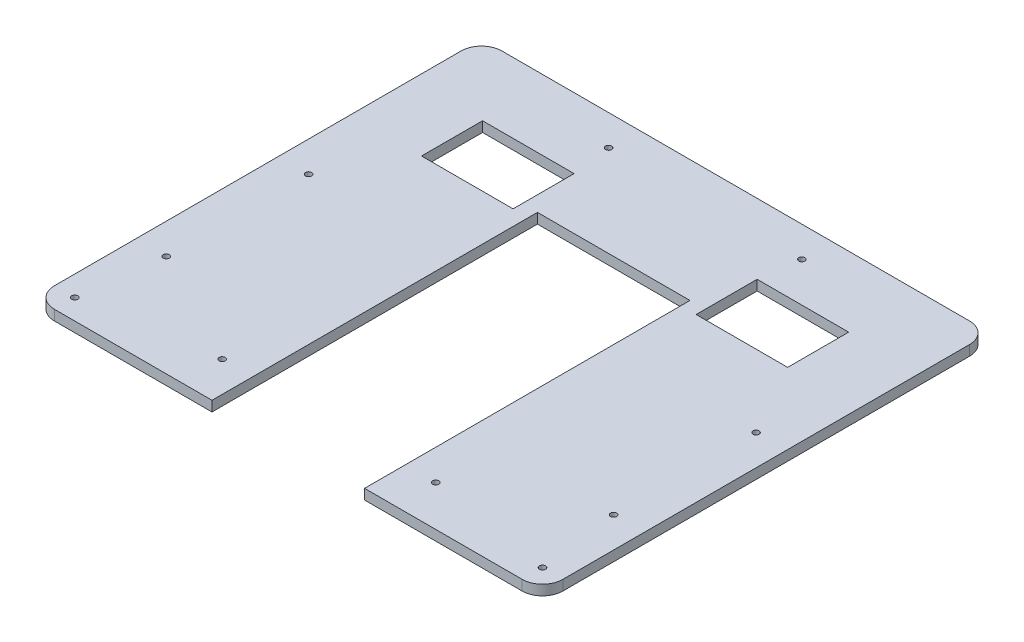
ISO-10303-21;
HEADER;
FILE_DESCRIPTION(('STEP AP214'),'2;1');
FILE_NAME('part.step','',(''),(''),'','','');
FILE_SCHEMA(('AUTOMOTIVE_DESIGN { 1 0 10303 214 1 1 1 1 }'));
ENDSEC;
DATA;
#1=APPLICATION_CONTEXT('core data for automotive mechanical design processes');
#2=APPLICATION_PROTOCOL_DEFINITION('international standard','automotive_design',2000,#1);
#3=PRODUCT_CONTEXT('',#1,'mechanical');
#4=PRODUCT('Part','Part','',(#3));
#5=PRODUCT_RELATED_PRODUCT_CATEGORY('part','',(#4));
#6=PRODUCT_DEFINITION_FORMATION('','',#4);
#7=PRODUCT_DEFINITION_CONTEXT('part definition',#1,'design');
#8=PRODUCT_DEFINITION('design','',#6,#7);
#9=PRODUCT_DEFINITION_SHAPE('','',#8);
#10=(LENGTH_UNIT() NAMED_UNIT(*) SI_UNIT(.MILLI.,.METRE.));
#11=(NAMED_UNIT(*) PLANE_ANGLE_UNIT() SI_UNIT($,.RADIAN.));
#12=(NAMED_UNIT(*) SI_UNIT($,.STERADIAN.) SOLID_ANGLE_UNIT());
#13=UNCERTAINTY_MEASURE_WITH_UNIT(LENGTH_MEASURE(1.E-05),#10,'distance_accuracy_value','');
#14=(GEOMETRIC_REPRESENTATION_CONTEXT(3) GLOBAL_UNCERTAINTY_ASSIGNED_CONTEXT((#13)) GLOBAL_UNIT_ASSIGNED_CONTEXT((#10,
#11,#12)) REPRESENTATION_CONTEXT('',''));
#15=CARTESIAN_POINT('',(0.,0.,0.));
#16=DIRECTION('',(0.,0.,1.));
#17=DIRECTION('',(1.,0.,0.));
#18=AXIS2_PLACEMENT_3D('',#15,#16,#17);
#19=CARTESIAN_POINT('',(10.,5.,210.));
#20=DIRECTION('',(0.,1.,0.));
#21=DIRECTION('',(0.,0.,1.));
#22=AXIS2_PLACEMENT_3D('',#19,#20,#21);
#23=PLANE('',#22);
#24=CARTESIAN_POINT('',(172.5,5.,15.));
#25=DIRECTION('',(0.,1.,0.));
#26=DIRECTION('',(0.,0.,1.));
#27=AXIS2_PLACEMENT_3D('',#24,#25,#26);
#28=CIRCLE('',#27,1.49999999999997);
#29=CARTESIAN_POINT('',(172.5,5.,16.5));
#30=VERTEX_POINT('',#29);
#31=EDGE_CURVE('E725',#30,#30,#28,.F.);
#32=ORIENTED_EDGE('',*,*,#31,.T.);
#33=EDGE_LOOP('',(#32));
#34=FACE_BOUND('',#33,.T.);
#35=CARTESIAN_POINT('',(240.,5.,210.));
#36=DIRECTION('',(0.,1.,0.));
#37=DIRECTION('',(0.,0.,1.));
#38=AXIS2_PLACEMENT_3D('',#35,#36,#37);
#39=CIRCLE('',#38,1.50000000000002);
#40=CARTESIAN_POINT('',(240.,5.,211.5));
#41=VERTEX_POINT('',#40);
#42=EDGE_CURVE('E802',#41,#41,#39,.F.);
#43=ORIENTED_EDGE('',*,*,#42,.T.);
#44=EDGE_LOOP('',(#43));
#45=FACE_BOUND('',#44,.T.);
#46=CARTESIAN_POINT('',(10.,5.,210.));
#47=DIRECTION('',(0.,1.,0.));
#48=DIRECTION('',(0.,0.,1.));
#49=AXIS2_PLACEMENT_3D('',#46,#47,#48);
#50=CIRCLE('',#49,1.5);
#51=CARTESIAN_POINT('',(10.,5.,211.5));
#52=VERTEX_POINT('',#51);
#53=EDGE_CURVE('E741',#52,#52,#50,.F.);
#54=ORIENTED_EDGE('',*,*,#53,.T.);
#55=EDGE_LOOP('',(#54));
#56=FACE_BOUND('',#55,.T.);
#57=CARTESIAN_POINT('',(77.5,5.,15.));
#58=DIRECTION('',(0.,1.,0.));
#59=DIRECTION('',(0.,0.,1.));
#60=AXIS2_PLACEMENT_3D('',#57,#58,#59);
#61=CIRCLE('',#60,1.5);
#62=CARTESIAN_POINT('',(77.5,5.,16.5));
#63=VERTEX_POINT('',#62);
#64=EDGE_CURVE('E738',#63,#63,#61,.F.);
#65=ORIENTED_EDGE('',*,*,#64,.T.);
#66=EDGE_LOOP('',(#65));
#67=FACE_BOUND('',#66,.T.);
#68=CARTESIAN_POINT('',(15.,5.,170.));
#69=DIRECTION('',(0.,1.,0.));
#70=DIRECTION('',(0.,0.,1.));
#71=AXIS2_PLACEMENT_3D('',#68,#69,#70);
#72=CIRCLE('',#71,1.5);
#73=CARTESIAN_POINT('',(15.,5.,171.5));
#74=VERTEX_POINT('',#73);
#75=EDGE_CURVE('E754',#74,#74,#72,.F.);
#76=ORIENTED_EDGE('',*,*,#75,.T.);
#77=EDGE_LOOP('',(#76));
#78=FACE_BOUND('',#77,.T.);
#79=CARTESIAN_POINT('',(15.,5.,100.));
#80=DIRECTION('',(0.,1.,0.));
#81=DIRECTION('',(0.,0.,1.));
#82=AXIS2_PLACEMENT_3D('',#79,#80,#81);
#83=CIRCLE('',#82,1.5);
#84=CARTESIAN_POINT('',(15.,5.,101.5));
#85=VERTEX_POINT('',#84);
#86=EDGE_CURVE('E748',#85,#85,#83,.F.);
#87=ORIENTED_EDGE('',*,*,#86,.T.);
#88=EDGE_LOOP('',(#87));
#89=FACE_BOUND('',#88,.T.);
#90=CARTESIAN_POINT('',(235.,5.,100.));
#91=DIRECTION('',(0.,1.,0.));
#92=DIRECTION('',(0.,0.,1.));
#93=AXIS2_PLACEMENT_3D('',#90,#91,#92);
#94=CIRCLE('',#93,1.5);
#95=CARTESIAN_POINT('',(235.,5.,101.5));
#96=VERTEX_POINT('',#95);
#97=EDGE_CURVE('E742',#96,#96,#94,.F.);
#98=ORIENTED_EDGE('',*,*,#97,.T.);
#99=EDGE_LOOP('',(#98));
#100=FACE_BOUND('',#99,.T.);
#101=CARTESIAN_POINT('',(235.,5.,170.));
#102=DIRECTION('',(0.,1.,0.));
#103=DIRECTION('',(0.,0.,1.));
#104=AXIS2_PLACEMENT_3D('',#101,#102,#103);
#105=CIRCLE('',#104,1.5);
#106=CARTESIAN_POINT('',(235.,5.,171.5));
#107=VERTEX_POINT('',#106);
#108=EDGE_CURVE('E393',#107,#107,#105,.F.);
#109=ORIENTED_EDGE('',*,*,#108,.T.);
#110=EDGE_LOOP('',(#109));
#111=FACE_BOUND('',#110,.T.);
#112=CARTESIAN_POINT('',(177.5,5.,200.));
#113=DIRECTION('',(0.,1.,0.));
#114=DIRECTION('',(0.,0.,1.));
#115=AXIS2_PLACEMENT_3D('',#112,#113,#114);
#116=CIRCLE('',#115,1.50000000000002);
#117=CARTESIAN_POINT('',(177.5,5.,201.5));
#118=VERTEX_POINT('',#117);
#119=EDGE_CURVE('E396',#118,#118,#116,.T.);
#120=ORIENTED_EDGE('',*,*,#119,.F.);
#121=EDGE_LOOP('',(#120));
#122=FACE_BOUND('',#121,.T.);
#123=DIRECTION('',(0.,0.,1.));
#124=VECTOR('',#123,1.);
#125=CARTESIAN_POINT('',(162.5,5.,220.));
#126=LINE('',#125,#124);
#127=CARTESIAN_POINT('',(162.5,5.,60.));
#128=VERTEX_POINT('',#127);
#129=CARTESIAN_POINT('',(162.5,5.,220.));
#130=VERTEX_POINT('',#129);
#131=EDGE_CURVE('E176',#128,#130,#126,.T.);
#132=ORIENTED_EDGE('',*,*,#131,.T.);
#133=DIRECTION('',(1.,0.,0.));
#134=VECTOR('',#133,1.);
#135=CARTESIAN_POINT('',(10.0000000000001,5.,220.));
#136=LINE('',#135,#134);
#137=CARTESIAN_POINT('',(240.,5.,220.));
#138=VERTEX_POINT('',#137);
#139=EDGE_CURVE('E188',#130,#138,#136,.T.);
#140=ORIENTED_EDGE('',*,*,#139,.T.);
#141=CARTESIAN_POINT('',(240.,5.,210.));
#142=DIRECTION('',(0.,1.,0.));
#143=DIRECTION('',(0.,0.,1.));
#144=AXIS2_PLACEMENT_3D('',#141,#142,#143);
#145=CIRCLE('',#144,10.);
#146=CARTESIAN_POINT('',(250.,5.,210.));
#147=VERTEX_POINT('',#146);
#148=EDGE_CURVE('E200',#138,#147,#145,.T.);
#149=ORIENTED_EDGE('',*,*,#148,.T.);
#150=DIRECTION('',(0.,0.,-1.));
#151=VECTOR('',#150,1.);
#152=CARTESIAN_POINT('',(250.,5.,10.0000000000001));
#153=LINE('',#152,#151);
#154=CARTESIAN_POINT('',(250.,5.,10.0000000000001));
#155=VERTEX_POINT('',#154);
#156=EDGE_CURVE('E207',#147,#155,#153,.T.);
#157=ORIENTED_EDGE('',*,*,#156,.T.);
#158=CARTESIAN_POINT('',(240.,5.,10.));
#159=DIRECTION('',(0.,1.,0.));
#160=DIRECTION('',(0.,0.,-1.));
#161=AXIS2_PLACEMENT_3D('',#158,#159,#160);
#162=CIRCLE('',#161,10.);
#163=CARTESIAN_POINT('',(240.,5.,0.));
#164=VERTEX_POINT('',#163);
#165=EDGE_CURVE('E209',#155,#164,#162,.T.);
#166=ORIENTED_EDGE('',*,*,#165,.T.);
#167=DIRECTION('',(-1.,0.,0.));
#168=VECTOR('',#167,1.);
#169=CARTESIAN_POINT('',(10.0000000000001,5.,0.));
#170=LINE('',#169,#168);
#171=CARTESIAN_POINT('',(10.0000000000001,5.,0.));
#172=VERTEX_POINT('',#171);
#173=EDGE_CURVE('E211',#164,#172,#170,.T.);
#174=ORIENTED_EDGE('',*,*,#173,.T.);
#175=CARTESIAN_POINT('',(10.,5.,10.));
#176=DIRECTION('',(0.,1.,0.));
#177=DIRECTION('',(0.,0.,1.));
#178=AXIS2_PLACEMENT_3D('',#175,#176,#177);
#179=CIRCLE('',#178,10.);
#180=CARTESIAN_POINT('',(0.,5.,10.0000000000001));
#181=VERTEX_POINT('',#180);
#182=EDGE_CURVE('E213',#172,#181,#179,.T.);
#183=ORIENTED_EDGE('',*,*,#182,.T.);
#184=DIRECTION('',(0.,0.,1.));
#185=VECTOR('',#184,1.);
#186=CARTESIAN_POINT('',(0.,5.,10.0000000000001));
#187=LINE('',#186,#185);
#188=CARTESIAN_POINT('',(0.,5.,210.));
#189=VERTEX_POINT('',#188);
#190=EDGE_CURVE('E215',#181,#189,#187,.T.);
#191=ORIENTED_EDGE('',*,*,#190,.T.);
#192=CARTESIAN_POINT('',(10.,5.,210.));
#193=DIRECTION('',(0.,1.,0.));
#194=DIRECTION('',(0.,0.,1.));
#195=AXIS2_PLACEMENT_3D('',#192,#193,#194);
#196=CIRCLE('',#195,10.);
#197=CARTESIAN_POINT('',(10.0000000000001,5.,220.));
#198=VERTEX_POINT('',#197);
#199=EDGE_CURVE('E197',#189,#198,#196,.T.);
#200=ORIENTED_EDGE('',*,*,#199,.T.);
#201=CARTESIAN_POINT('',(87.4999999999999,5.,220.));
#202=VERTEX_POINT('',#201);
#203=EDGE_CURVE('E196',#198,#202,#136,.T.);
#204=ORIENTED_EDGE('',*,*,#203,.T.);
#205=DIRECTION('',(0.,0.,-1.));
#206=VECTOR('',#205,1.);
#207=CARTESIAN_POINT('',(87.5,5.,220.));
#208=LINE('',#207,#206);
#209=CARTESIAN_POINT('',(87.5,5.,60.));
#210=VERTEX_POINT('',#209);
#211=EDGE_CURVE('E51',#202,#210,#208,.T.);
#212=ORIENTED_EDGE('',*,*,#211,.T.);
#213=DIRECTION('',(1.,0.,0.));
#214=VECTOR('',#213,1.);
#215=CARTESIAN_POINT('',(162.5,5.,60.));
#216=LINE('',#215,#214);
#217=EDGE_CURVE('E184',#210,#128,#216,.T.);
#218=ORIENTED_EDGE('',*,*,#217,.T.);
#219=EDGE_LOOP('',(#132,#140,#149,#157,#166,#174,#183,#191,#200,#204,#212,#218));
#220=FACE_BOUND('',#219,.T.);
#221=DIRECTION('',(-1.,0.,0.));
#222=VECTOR('',#221,1.);
#223=CARTESIAN_POINT('',(215.,5.,34.475));
#224=LINE('',#223,#222);
#225=CARTESIAN_POINT('',(215.,5.,34.475));
#226=VERTEX_POINT('',#225);
#227=CARTESIAN_POINT('',(170.,5.,34.475));
#228=VERTEX_POINT('',#227);
#229=EDGE_CURVE('E356',#226,#228,#224,.T.);
#230=ORIENTED_EDGE('',*,*,#229,.F.);
#231=DIRECTION('',(0.,0.,-1.));
#232=VECTOR('',#231,1.);
#233=CARTESIAN_POINT('',(215.,5.,64.475));
#234=LINE('',#233,#232);
#235=CARTESIAN_POINT('',(215.,5.,64.475));
#236=VERTEX_POINT('',#235);
#237=EDGE_CURVE('E343',#236,#226,#234,.T.);
#238=ORIENTED_EDGE('',*,*,#237,.F.);
#239=DIRECTION('',(-1.,0.,0.));
#240=VECTOR('',#239,1.);
#241=CARTESIAN_POINT('',(215.,5.,64.475));
#242=LINE('',#241,#240);
#243=CARTESIAN_POINT('',(170.,5.,64.475));
#244=VERTEX_POINT('',#243);
#245=EDGE_CURVE('E338',#236,#244,#242,.T.);
#246=ORIENTED_EDGE('',*,*,#245,.T.);
#247=DIRECTION('',(0.,0.,-1.));
#248=VECTOR('',#247,1.);
#249=CARTESIAN_POINT('',(170.,5.,64.475));
#250=LINE('',#249,#248);
#251=EDGE_CURVE('E353',#244,#228,#250,.T.);
#252=ORIENTED_EDGE('',*,*,#251,.T.);
#253=EDGE_LOOP('',(#230,#238,#246,#252));
#254=FACE_BOUND('',#253,.T.);
#255=DIRECTION('',(1.,0.,0.));
#256=VECTOR('',#255,1.);
#257=CARTESIAN_POINT('',(0.,5.,34.475));
#258=LINE('',#257,#256);
#259=CARTESIAN_POINT('',(35.,5.,34.475));
#260=VERTEX_POINT('',#259);
#261=CARTESIAN_POINT('',(80.,5.,34.475));
#262=VERTEX_POINT('',#261);
#263=EDGE_CURVE('E305',#260,#262,#258,.T.);
#264=ORIENTED_EDGE('',*,*,#263,.T.);
#265=DIRECTION('',(0.,0.,-1.));
#266=VECTOR('',#265,1.);
#267=CARTESIAN_POINT('',(80.,5.,0.));
#268=LINE('',#267,#266);
#269=CARTESIAN_POINT('',(80.,5.,64.475));
#270=VERTEX_POINT('',#269);
#271=EDGE_CURVE('E299',#270,#262,#268,.T.);
#272=ORIENTED_EDGE('',*,*,#271,.F.);
#273=DIRECTION('',(1.,0.,0.));
#274=VECTOR('',#273,1.);
#275=CARTESIAN_POINT('',(0.,5.,64.475));
#276=LINE('',#275,#274);
#277=CARTESIAN_POINT('',(35.,5.,64.475));
#278=VERTEX_POINT('',#277);
#279=EDGE_CURVE('E301',#278,#270,#276,.T.);
#280=ORIENTED_EDGE('',*,*,#279,.F.);
#281=DIRECTION('',(0.,0.,-1.));
#282=VECTOR('',#281,1.);
#283=CARTESIAN_POINT('',(35.,5.,0.));
#284=LINE('',#283,#282);
#285=EDGE_CURVE('E59',#278,#260,#284,.T.);
#286=ORIENTED_EDGE('',*,*,#285,.T.);
#287=EDGE_LOOP('',(#264,#272,#280,#286));
#288=FACE_BOUND('',#287,.T.);
#289=CARTESIAN_POINT('',(72.5,5.,200.));
#290=DIRECTION('',(0.,1.,0.));
#291=DIRECTION('',(0.,0.,1.));
#292=AXIS2_PLACEMENT_3D('',#289,#290,#291);
#293=CIRCLE('',#292,1.50000000000001);
#294=CARTESIAN_POINT('',(72.5,5.,201.5));
#295=VERTEX_POINT('',#294);
#296=EDGE_CURVE('E386',#295,#295,#293,.F.);
#297=ORIENTED_EDGE('',*,*,#296,.T.);
#298=EDGE_LOOP('',(#297));
#299=FACE_BOUND('',#298,.T.);
#300=ADVANCED_FACE('F36',(#34,#45,#56,#67,#78,#89,#100,#111,#122,#220,#254,#288,#299),#23,.T.);
#301=CARTESIAN_POINT('',(10.,0.,210.));
#302=DIRECTION('',(0.,1.,0.));
#303=DIRECTION('',(0.,0.,1.));
#304=AXIS2_PLACEMENT_3D('',#301,#302,#303);
#305=PLANE('',#304);
#306=CARTESIAN_POINT('',(172.5,0.,15.));
#307=DIRECTION('',(0.,-1.,0.));
#308=DIRECTION('',(0.,0.,1.));
#309=AXIS2_PLACEMENT_3D('',#306,#307,#308);
#310=CIRCLE('',#309,1.49999999999997);
#311=CARTESIAN_POINT('',(172.5,0.,16.5));
#312=VERTEX_POINT('',#311);
#313=EDGE_CURVE('E728',#312,#312,#310,.T.);
#314=ORIENTED_EDGE('',*,*,#313,.F.);
#315=EDGE_LOOP('',(#314));
#316=FACE_BOUND('',#315,.T.);
#317=CARTESIAN_POINT('',(240.,0.,210.));
#318=DIRECTION('',(0.,-1.,0.));
#319=DIRECTION('',(0.,0.,1.));
#320=AXIS2_PLACEMENT_3D('',#317,#318,#319);
#321=CIRCLE('',#320,1.50000000000002);
#322=CARTESIAN_POINT('',(240.,0.,211.5));
#323=VERTEX_POINT('',#322);
#324=EDGE_CURVE('E730',#323,#323,#321,.T.);
#325=ORIENTED_EDGE('',*,*,#324,.F.);
#326=EDGE_LOOP('',(#325));
#327=FACE_BOUND('',#326,.T.);
#328=CARTESIAN_POINT('',(10.,0.,210.));
#329=DIRECTION('',(0.,-1.,0.));
#330=DIRECTION('',(0.,0.,-1.));
#331=AXIS2_PLACEMENT_3D('',#328,#329,#330);
#332=CIRCLE('',#331,1.5);
#333=CARTESIAN_POINT('',(10.,0.,208.5));
#334=VERTEX_POINT('',#333);
#335=EDGE_CURVE('E797',#334,#334,#332,.T.);
#336=ORIENTED_EDGE('',*,*,#335,.F.);
#337=EDGE_LOOP('',(#336));
#338=FACE_BOUND('',#337,.T.);
#339=CARTESIAN_POINT('',(77.5,0.,15.));
#340=DIRECTION('',(0.,-1.,0.));
#341=DIRECTION('',(0.,0.,-1.));
#342=AXIS2_PLACEMENT_3D('',#339,#340,#341);
#343=CIRCLE('',#342,1.5);
#344=CARTESIAN_POINT('',(77.5,0.,13.5));
#345=VERTEX_POINT('',#344);
#346=EDGE_CURVE('E734',#345,#345,#343,.T.);
#347=ORIENTED_EDGE('',*,*,#346,.F.);
#348=EDGE_LOOP('',(#347));
#349=FACE_BOUND('',#348,.T.);
#350=CARTESIAN_POINT('',(15.,0.,170.));
#351=DIRECTION('',(0.,-1.,0.));
#352=DIRECTION('',(0.,0.,1.));
#353=AXIS2_PLACEMENT_3D('',#350,#351,#352);
#354=CIRCLE('',#353,1.5);
#355=CARTESIAN_POINT('',(15.,0.,171.5));
#356=VERTEX_POINT('',#355);
#357=EDGE_CURVE('E737',#356,#356,#354,.T.);
#358=ORIENTED_EDGE('',*,*,#357,.F.);
#359=EDGE_LOOP('',(#358));
#360=FACE_BOUND('',#359,.T.);
#361=CARTESIAN_POINT('',(15.,0.,100.));
#362=DIRECTION('',(0.,-1.,0.));
#363=DIRECTION('',(0.,0.,1.));
#364=AXIS2_PLACEMENT_3D('',#361,#362,#363);
#365=CIRCLE('',#364,1.5);
#366=CARTESIAN_POINT('',(15.,0.,101.5));
#367=VERTEX_POINT('',#366);
#368=EDGE_CURVE('E751',#367,#367,#365,.T.);
#369=ORIENTED_EDGE('',*,*,#368,.F.);
#370=EDGE_LOOP('',(#369));
#371=FACE_BOUND('',#370,.T.);
#372=CARTESIAN_POINT('',(235.,0.,100.));
#373=DIRECTION('',(0.,-1.,0.));
#374=DIRECTION('',(0.,0.,-1.));
#375=AXIS2_PLACEMENT_3D('',#372,#373,#374);
#376=CIRCLE('',#375,1.5);
#377=CARTESIAN_POINT('',(235.,0.,98.5));
#378=VERTEX_POINT('',#377);
#379=EDGE_CURVE('E745',#378,#378,#376,.T.);
#380=ORIENTED_EDGE('',*,*,#379,.F.);
#381=EDGE_LOOP('',(#380));
#382=FACE_BOUND('',#381,.T.);
#383=CARTESIAN_POINT('',(235.,0.,170.));
#384=DIRECTION('',(0.,-1.,0.));
#385=DIRECTION('',(0.,0.,-1.));
#386=AXIS2_PLACEMENT_3D('',#383,#384,#385);
#387=CIRCLE('',#386,1.5);
#388=CARTESIAN_POINT('',(235.,0.,168.5));
#389=VERTEX_POINT('',#388);
#390=EDGE_CURVE('E399',#389,#389,#387,.T.);
#391=ORIENTED_EDGE('',*,*,#390,.F.);
#392=EDGE_LOOP('',(#391));
#393=FACE_BOUND('',#392,.T.);
#394=DIRECTION('',(0.,0.,-1.));
#395=VECTOR('',#394,1.);
#396=CARTESIAN_POINT('',(80.,0.,0.));
#397=LINE('',#396,#395);
#398=CARTESIAN_POINT('',(80.,0.,64.475));
#399=VERTEX_POINT('',#398);
#400=CARTESIAN_POINT('',(80.,0.,34.475));
#401=VERTEX_POINT('',#400);
#402=EDGE_CURVE('E309',#399,#401,#397,.T.);
#403=ORIENTED_EDGE('',*,*,#402,.T.);
#404=DIRECTION('',(1.,0.,0.));
#405=VECTOR('',#404,1.);
#406=CARTESIAN_POINT('',(0.,0.,34.475));
#407=LINE('',#406,#405);
#408=CARTESIAN_POINT('',(35.,0.,34.475));
#409=VERTEX_POINT('',#408);
#410=EDGE_CURVE('E302',#409,#401,#407,.T.);
#411=ORIENTED_EDGE('',*,*,#410,.F.);
#412=DIRECTION('',(0.,0.,-1.));
#413=VECTOR('',#412,1.);
#414=CARTESIAN_POINT('',(35.,0.,0.));
#415=LINE('',#414,#413);
#416=CARTESIAN_POINT('',(35.,0.,64.475));
#417=VERTEX_POINT('',#416);
#418=EDGE_CURVE('E316',#417,#409,#415,.T.);
#419=ORIENTED_EDGE('',*,*,#418,.F.);
#420=DIRECTION('',(1.,0.,0.));
#421=VECTOR('',#420,1.);
#422=CARTESIAN_POINT('',(0.,0.,64.475));
#423=LINE('',#422,#421);
#424=EDGE_CURVE('E312',#417,#399,#423,.T.);
#425=ORIENTED_EDGE('',*,*,#424,.T.);
#426=EDGE_LOOP('',(#403,#411,#419,#425));
#427=FACE_BOUND('',#426,.T.);
#428=DIRECTION('',(1.,0.,0.));
#429=VECTOR('',#428,1.);
#430=CARTESIAN_POINT('',(10.0000000000001,0.,220.));
#431=LINE('',#430,#429);
#432=CARTESIAN_POINT('',(162.5,0.,220.));
#433=VERTEX_POINT('',#432);
#434=CARTESIAN_POINT('',(240.,0.,220.));
#435=VERTEX_POINT('',#434);
#436=EDGE_CURVE('E221',#433,#435,#431,.T.);
#437=ORIENTED_EDGE('',*,*,#436,.F.);
#438=DIRECTION('',(0.,0.,1.));
#439=VECTOR('',#438,1.);
#440=CARTESIAN_POINT('',(162.5,0.,220.));
#441=LINE('',#440,#439);
#442=CARTESIAN_POINT('',(162.5,0.,60.));
#443=VERTEX_POINT('',#442);
#444=EDGE_CURVE('E179',#443,#433,#441,.T.);
#445=ORIENTED_EDGE('',*,*,#444,.F.);
#446=DIRECTION('',(1.,0.,0.));
#447=VECTOR('',#446,1.);
#448=CARTESIAN_POINT('',(162.5,0.,60.));
#449=LINE('',#448,#447);
#450=CARTESIAN_POINT('',(87.5,0.,60.));
#451=VERTEX_POINT('',#450);
#452=EDGE_CURVE('E191',#451,#443,#449,.T.);
#453=ORIENTED_EDGE('',*,*,#452,.F.);
#454=DIRECTION('',(0.,0.,-1.));
#455=VECTOR('',#454,1.);
#456=CARTESIAN_POINT('',(87.5,0.,220.));
#457=LINE('',#456,#455);
#458=CARTESIAN_POINT('',(87.5,0.,220.));
#459=VERTEX_POINT('',#458);
#460=EDGE_CURVE('E388',#459,#451,#457,.T.);
#461=ORIENTED_EDGE('',*,*,#460,.F.);
#462=CARTESIAN_POINT('',(10.0000000000001,0.,220.));
#463=VERTEX_POINT('',#462);
#464=EDGE_CURVE('E223',#463,#459,#431,.T.);
#465=ORIENTED_EDGE('',*,*,#464,.F.);
#466=CARTESIAN_POINT('',(10.,0.,210.));
#467=DIRECTION('',(0.,1.,0.));
#468=DIRECTION('',(0.,0.,1.));
#469=AXIS2_PLACEMENT_3D('',#466,#467,#468);
#470=CIRCLE('',#469,10.);
#471=CARTESIAN_POINT('',(0.,0.,210.));
#472=VERTEX_POINT('',#471);
#473=EDGE_CURVE('E218',#472,#463,#470,.T.);
#474=ORIENTED_EDGE('',*,*,#473,.F.);
#475=DIRECTION('',(0.,0.,1.));
#476=VECTOR('',#475,1.);
#477=CARTESIAN_POINT('',(0.,0.,10.0000000000001));
#478=LINE('',#477,#476);
#479=CARTESIAN_POINT('',(0.,0.,10.0000000000001));
#480=VERTEX_POINT('',#479);
#481=EDGE_CURVE('E202',#480,#472,#478,.T.);
#482=ORIENTED_EDGE('',*,*,#481,.F.);
#483=CARTESIAN_POINT('',(10.,0.,10.));
#484=DIRECTION('',(0.,1.,0.));
#485=DIRECTION('',(0.,0.,1.));
#486=AXIS2_PLACEMENT_3D('',#483,#484,#485);
#487=CIRCLE('',#486,10.);
#488=CARTESIAN_POINT('',(10.0000000000001,0.,0.));
#489=VERTEX_POINT('',#488);
#490=EDGE_CURVE('E234',#489,#480,#487,.T.);
#491=ORIENTED_EDGE('',*,*,#490,.F.);
#492=DIRECTION('',(-1.,0.,0.));
#493=VECTOR('',#492,1.);
#494=CARTESIAN_POINT('',(10.0000000000001,0.,0.));
#495=LINE('',#494,#493);
#496=CARTESIAN_POINT('',(240.,0.,0.));
#497=VERTEX_POINT('',#496);
#498=EDGE_CURVE('E232',#497,#489,#495,.T.);
#499=ORIENTED_EDGE('',*,*,#498,.F.);
#500=CARTESIAN_POINT('',(240.,0.,10.));
#501=DIRECTION('',(0.,1.,0.));
#502=DIRECTION('',(0.,0.,-1.));
#503=AXIS2_PLACEMENT_3D('',#500,#501,#502);
#504=CIRCLE('',#503,10.);
#505=CARTESIAN_POINT('',(250.,0.,10.0000000000001));
#506=VERTEX_POINT('',#505);
#507=EDGE_CURVE('E230',#506,#497,#504,.T.);
#508=ORIENTED_EDGE('',*,*,#507,.F.);
#509=DIRECTION('',(0.,0.,-1.));
#510=VECTOR('',#509,1.);
#511=CARTESIAN_POINT('',(250.,0.,10.0000000000001));
#512=LINE('',#511,#510);
#513=CARTESIAN_POINT('',(250.,0.,210.));
#514=VERTEX_POINT('',#513);
#515=EDGE_CURVE('E228',#514,#506,#512,.T.);
#516=ORIENTED_EDGE('',*,*,#515,.F.);
#517=CARTESIAN_POINT('',(240.,0.,210.));
#518=DIRECTION('',(0.,1.,0.));
#519=DIRECTION('',(0.,0.,1.));
#520=AXIS2_PLACEMENT_3D('',#517,#518,#519);
#521=CIRCLE('',#520,10.);
#522=EDGE_CURVE('E226',#435,#514,#521,.T.);
#523=ORIENTED_EDGE('',*,*,#522,.F.);
#524=EDGE_LOOP('',(#437,#445,#453,#461,#465,#474,#482,#491,#499,#508,#516,#523));
#525=FACE_BOUND('',#524,.T.);
#526=DIRECTION('',(0.,0.,-1.));
#527=VECTOR('',#526,1.);
#528=CARTESIAN_POINT('',(215.,0.,64.475));
#529=LINE('',#528,#527);
#530=CARTESIAN_POINT('',(215.,0.,64.475));
#531=VERTEX_POINT('',#530);
#532=CARTESIAN_POINT('',(215.,0.,34.475));
#533=VERTEX_POINT('',#532);
#534=EDGE_CURVE('E313',#531,#533,#529,.T.);
#535=ORIENTED_EDGE('',*,*,#534,.T.);
#536=DIRECTION('',(-1.,0.,0.));
#537=VECTOR('',#536,1.);
#538=CARTESIAN_POINT('',(215.,0.,34.475));
#539=LINE('',#538,#537);
#540=CARTESIAN_POINT('',(170.,0.,34.475));
#541=VERTEX_POINT('',#540);
#542=EDGE_CURVE('E346',#533,#541,#539,.T.);
#543=ORIENTED_EDGE('',*,*,#542,.T.);
#544=DIRECTION('',(0.,0.,-1.));
#545=VECTOR('',#544,1.);
#546=CARTESIAN_POINT('',(170.,0.,64.475));
#547=LINE('',#546,#545);
#548=CARTESIAN_POINT('',(170.,0.,64.475));
#549=VERTEX_POINT('',#548);
#550=EDGE_CURVE('E342',#549,#541,#547,.T.);
#551=ORIENTED_EDGE('',*,*,#550,.F.);
#552=DIRECTION('',(-1.,0.,0.));
#553=VECTOR('',#552,1.);
#554=CARTESIAN_POINT('',(215.,0.,64.475));
#555=LINE('',#554,#553);
#556=EDGE_CURVE('E339',#531,#549,#555,.T.);
#557=ORIENTED_EDGE('',*,*,#556,.F.);
#558=EDGE_LOOP('',(#535,#543,#551,#557));
#559=FACE_BOUND('',#558,.T.);
#560=CARTESIAN_POINT('',(177.5,0.,200.));
#561=DIRECTION('',(0.,1.,0.));
#562=DIRECTION('',(0.,0.,1.));
#563=AXIS2_PLACEMENT_3D('',#560,#561,#562);
#564=CIRCLE('',#563,1.50000000000002);
#565=CARTESIAN_POINT('',(177.5,0.,201.5));
#566=VERTEX_POINT('',#565);
#567=EDGE_CURVE('E381',#566,#566,#564,.T.);
#568=ORIENTED_EDGE('',*,*,#567,.T.);
#569=EDGE_LOOP('',(#568));
#570=FACE_BOUND('',#569,.T.);
#571=CARTESIAN_POINT('',(72.5,0.,200.));
#572=DIRECTION('',(0.,-1.,0.));
#573=DIRECTION('',(0.,0.,-1.));
#574=AXIS2_PLACEMENT_3D('',#571,#572,#573);
#575=CIRCLE('',#574,1.50000000000001);
#576=CARTESIAN_POINT('',(72.5,0.,198.5));
#577=VERTEX_POINT('',#576);
#578=EDGE_CURVE('E384',#577,#577,#575,.T.);
#579=ORIENTED_EDGE('',*,*,#578,.F.);
#580=EDGE_LOOP('',(#579));
#581=FACE_BOUND('',#580,.T.);
#582=ADVANCED_FACE('F259',(#316,#327,#338,#349,#360,#371,#382,#393,#427,#525,#559,#570,#581),
#305,.F.);
#583=CARTESIAN_POINT('',(10.0000000000001,5.,220.));
#584=DIRECTION('',(0.,0.,-1.));
#585=DIRECTION('',(-1.,0.,0.));
#586=AXIS2_PLACEMENT_3D('',#583,#584,#585);
#587=PLANE('',#586);
#588=ORIENTED_EDGE('',*,*,#139,.F.);
#589=DIRECTION('',(0.,-1.,0.));
#590=VECTOR('',#589,1.);
#591=CARTESIAN_POINT('',(162.5,5.,220.));
#592=LINE('',#591,#590);
#593=EDGE_CURVE('E173',#130,#433,#592,.T.);
#594=ORIENTED_EDGE('',*,*,#593,.T.);
#595=ORIENTED_EDGE('',*,*,#436,.T.);
#596=DIRECTION('',(0.,-1.,0.));
#597=VECTOR('',#596,1.);
#598=CARTESIAN_POINT('',(240.,5.,220.));
#599=LINE('',#598,#597);
#600=EDGE_CURVE('E44',#138,#435,#599,.T.);
#601=ORIENTED_EDGE('',*,*,#600,.F.);
#602=EDGE_LOOP('',(#588,#594,#595,#601));
#603=FACE_BOUND('',#602,.T.);
#604=ADVANCED_FACE('F193',(#603),#587,.F.);
#605=CARTESIAN_POINT('',(10.,5.,210.));
#606=DIRECTION('',(0.,-1.,0.));
#607=DIRECTION('',(0.,0.,-1.));
#608=AXIS2_PLACEMENT_3D('',#605,#606,#607);
#609=CYLINDRICAL_SURFACE('',#608,10.);
#610=ORIENTED_EDGE('',*,*,#473,.T.);
#611=DIRECTION('',(0.,-1.,0.));
#612=VECTOR('',#611,1.);
#613=CARTESIAN_POINT('',(10.0000000000001,5.,220.));
#614=LINE('',#613,#612);
#615=EDGE_CURVE('E11',#198,#463,#614,.T.);
#616=ORIENTED_EDGE('',*,*,#615,.F.);
#617=ORIENTED_EDGE('',*,*,#199,.F.);
#618=DIRECTION('',(0.,-1.,0.));
#619=VECTOR('',#618,1.);
#620=CARTESIAN_POINT('',(0.,5.,210.));
#621=LINE('',#620,#619);
#622=EDGE_CURVE('E217',#189,#472,#621,.T.);
#623=ORIENTED_EDGE('',*,*,#622,.T.);
#624=EDGE_LOOP('',(#610,#616,#617,#623));
#625=FACE_BOUND('',#624,.T.);
#626=ADVANCED_FACE('F38',(#625),#609,.T.);
#627=ORIENTED_EDGE('',*,*,#464,.T.);
#628=DIRECTION('',(0.,-1.,0.));
#629=VECTOR('',#628,1.);
#630=CARTESIAN_POINT('',(87.5,5.,220.));
#631=LINE('',#630,#629);
#632=EDGE_CURVE('E183',#202,#459,#631,.T.);
#633=ORIENTED_EDGE('',*,*,#632,.F.);
#634=ORIENTED_EDGE('',*,*,#203,.F.);
#635=ORIENTED_EDGE('',*,*,#615,.T.);
#636=EDGE_LOOP('',(#627,#633,#634,#635));
#637=FACE_BOUND('',#636,.T.);
#638=ADVANCED_FACE('F290',(#637),#587,.F.);
#639=CARTESIAN_POINT('',(240.,5.,210.));
#640=DIRECTION('',(0.,-1.,0.));
#641=DIRECTION('',(0.,0.,-1.));
#642=AXIS2_PLACEMENT_3D('',#639,#640,#641);
#643=CYLINDRICAL_SURFACE('',#642,10.);
#644=ORIENTED_EDGE('',*,*,#522,.T.);
#645=DIRECTION('',(0.,-1.,0.));
#646=VECTOR('',#645,1.);
#647=CARTESIAN_POINT('',(250.,5.,210.));
#648=LINE('',#647,#646);
#649=EDGE_CURVE('E251',#147,#514,#648,.T.);
#650=ORIENTED_EDGE('',*,*,#649,.F.);
#651=ORIENTED_EDGE('',*,*,#148,.F.);
#652=ORIENTED_EDGE('',*,*,#600,.T.);
#653=EDGE_LOOP('',(#644,#650,#651,#652));
#654=FACE_BOUND('',#653,.T.);
#655=ADVANCED_FACE('F255',(#654),#643,.T.);
#656=CARTESIAN_POINT('',(250.,5.,10.0000000000001));
#657=DIRECTION('',(-1.,0.,0.));
#658=DIRECTION('',(0.,0.,1.));
#659=AXIS2_PLACEMENT_3D('',#656,#657,#658);
#660=PLANE('',#659);
#661=ORIENTED_EDGE('',*,*,#515,.T.);
#662=DIRECTION('',(0.,-1.,0.));
#663=VECTOR('',#662,1.);
#664=CARTESIAN_POINT('',(250.,5.,10.0000000000001));
#665=LINE('',#664,#663);
#666=EDGE_CURVE('E248',#155,#506,#665,.T.);
#667=ORIENTED_EDGE('',*,*,#666,.F.);
#668=ORIENTED_EDGE('',*,*,#156,.F.);
#669=ORIENTED_EDGE('',*,*,#649,.T.);
#670=EDGE_LOOP('',(#661,#667,#668,#669));
#671=FACE_BOUND('',#670,.T.);
#672=ADVANCED_FACE('F265',(#671),#660,.F.);
#673=CARTESIAN_POINT('',(240.,5.,10.));
#674=DIRECTION('',(0.,-1.,0.));
#675=DIRECTION('',(0.,0.,-1.));
#676=AXIS2_PLACEMENT_3D('',#673,#674,#675);
#677=CYLINDRICAL_SURFACE('',#676,10.);
#678=ORIENTED_EDGE('',*,*,#507,.T.);
#679=DIRECTION('',(0.,-1.,0.));
#680=VECTOR('',#679,1.);
#681=CARTESIAN_POINT('',(240.,5.,0.));
#682=LINE('',#681,#680);
#683=EDGE_CURVE('E245',#164,#497,#682,.T.);
#684=ORIENTED_EDGE('',*,*,#683,.F.);
#685=ORIENTED_EDGE('',*,*,#165,.F.);
#686=ORIENTED_EDGE('',*,*,#666,.T.);
#687=EDGE_LOOP('',(#678,#684,#685,#686));
#688=FACE_BOUND('',#687,.T.);
#689=ADVANCED_FACE('F269',(#688),#677,.T.);
#690=CARTESIAN_POINT('',(10.0000000000001,5.,0.));
#691=DIRECTION('',(0.,0.,1.));
#692=DIRECTION('',(1.,0.,0.));
#693=AXIS2_PLACEMENT_3D('',#690,#691,#692);
#694=PLANE('',#693);
#695=ORIENTED_EDGE('',*,*,#498,.T.);
#696=DIRECTION('',(0.,-1.,0.));
#697=VECTOR('',#696,1.);
#698=CARTESIAN_POINT('',(10.0000000000001,5.,0.));
#699=LINE('',#698,#697);
#700=EDGE_CURVE('E242',#172,#489,#699,.T.);
#701=ORIENTED_EDGE('',*,*,#700,.F.);
#702=ORIENTED_EDGE('',*,*,#173,.F.);
#703=ORIENTED_EDGE('',*,*,#683,.T.);
#704=EDGE_LOOP('',(#695,#701,#702,#703));
#705=FACE_BOUND('',#704,.T.);
#706=ADVANCED_FACE('F276',(#705),#694,.F.);
#707=CARTESIAN_POINT('',(10.,5.,10.));
#708=DIRECTION('',(0.,-1.,0.));
#709=DIRECTION('',(0.,0.,-1.));
#710=AXIS2_PLACEMENT_3D('',#707,#708,#709);
#711=CYLINDRICAL_SURFACE('',#710,10.);
#712=ORIENTED_EDGE('',*,*,#490,.T.);
#713=DIRECTION('',(0.,-1.,0.));
#714=VECTOR('',#713,1.);
#715=CARTESIAN_POINT('',(0.,5.,10.0000000000001));
#716=LINE('',#715,#714);
#717=EDGE_CURVE('E239',#181,#480,#716,.T.);
#718=ORIENTED_EDGE('',*,*,#717,.F.);
#719=ORIENTED_EDGE('',*,*,#182,.F.);
#720=ORIENTED_EDGE('',*,*,#700,.T.);
#721=EDGE_LOOP('',(#712,#718,#719,#720));
#722=FACE_BOUND('',#721,.T.);
#723=ADVANCED_FACE('F279',(#722),#711,.T.);
#724=CARTESIAN_POINT('',(0.,5.,10.0000000000001));
#725=DIRECTION('',(1.,0.,0.));
#726=DIRECTION('',(0.,0.,-1.));
#727=AXIS2_PLACEMENT_3D('',#724,#725,#726);
#728=PLANE('',#727);
#729=ORIENTED_EDGE('',*,*,#481,.T.);
#730=ORIENTED_EDGE('',*,*,#622,.F.);
#731=ORIENTED_EDGE('',*,*,#190,.F.);
#732=ORIENTED_EDGE('',*,*,#717,.T.);
#733=EDGE_LOOP('',(#729,#730,#731,#732));
#734=FACE_BOUND('',#733,.T.);
#735=ADVANCED_FACE('F284',(#734),#728,.F.);
#736=CARTESIAN_POINT('',(215.,5.,64.475));
#737=DIRECTION('',(-1.,0.,0.));
#738=DIRECTION('',(0.,0.,1.));
#739=AXIS2_PLACEMENT_3D('',#736,#737,#738);
#740=PLANE('',#739);
#741=ORIENTED_EDGE('',*,*,#534,.F.);
#742=DIRECTION('',(0.,-1.,0.));
#743=VECTOR('',#742,1.);
#744=CARTESIAN_POINT('',(215.,5.,64.475));
#745=LINE('',#744,#743);
#746=EDGE_CURVE('E335',#236,#531,#745,.T.);
#747=ORIENTED_EDGE('',*,*,#746,.F.);
#748=ORIENTED_EDGE('',*,*,#237,.T.);
#749=DIRECTION('',(0.,-1.,0.));
#750=VECTOR('',#749,1.);
#751=CARTESIAN_POINT('',(215.,5.,34.475));
#752=LINE('',#751,#750);
#753=EDGE_CURVE('E328',#226,#533,#752,.T.);
#754=ORIENTED_EDGE('',*,*,#753,.T.);
#755=EDGE_LOOP('',(#741,#747,#748,#754));
#756=FACE_BOUND('',#755,.T.);
#757=ADVANCED_FACE('F360',(#756),#740,.T.);
#758=CARTESIAN_POINT('',(215.,5.,34.475));
#759=DIRECTION('',(0.,0.,1.));
#760=DIRECTION('',(1.,0.,0.));
#761=AXIS2_PLACEMENT_3D('',#758,#759,#760);
#762=PLANE('',#761);
#763=ORIENTED_EDGE('',*,*,#542,.F.);
#764=ORIENTED_EDGE('',*,*,#753,.F.);
#765=ORIENTED_EDGE('',*,*,#229,.T.);
#766=DIRECTION('',(0.,-1.,0.));
#767=VECTOR('',#766,1.);
#768=CARTESIAN_POINT('',(170.,5.,34.475));
#769=LINE('',#768,#767);
#770=EDGE_CURVE('E331',#228,#541,#769,.T.);
#771=ORIENTED_EDGE('',*,*,#770,.T.);
#772=EDGE_LOOP('',(#763,#764,#765,#771));
#773=FACE_BOUND('',#772,.T.);
#774=ADVANCED_FACE('F364',(#773),#762,.T.);
#775=CARTESIAN_POINT('',(170.,5.,64.475));
#776=DIRECTION('',(-1.,0.,0.));
#777=DIRECTION('',(0.,0.,1.));
#778=AXIS2_PLACEMENT_3D('',#775,#776,#777);
#779=PLANE('',#778);
#780=ORIENTED_EDGE('',*,*,#550,.T.);
#781=ORIENTED_EDGE('',*,*,#770,.F.);
#782=ORIENTED_EDGE('',*,*,#251,.F.);
#783=DIRECTION('',(0.,-1.,0.));
#784=VECTOR('',#783,1.);
#785=CARTESIAN_POINT('',(170.,5.,64.475));
#786=LINE('',#785,#784);
#787=EDGE_CURVE('E333',#244,#549,#786,.T.);
#788=ORIENTED_EDGE('',*,*,#787,.T.);
#789=EDGE_LOOP('',(#780,#781,#782,#788));
#790=FACE_BOUND('',#789,.T.);
#791=ADVANCED_FACE('F369',(#790),#779,.F.);
#792=CARTESIAN_POINT('',(215.,5.,64.475));
#793=DIRECTION('',(0.,0.,1.));
#794=DIRECTION('',(1.,0.,0.));
#795=AXIS2_PLACEMENT_3D('',#792,#793,#794);
#796=PLANE('',#795);
#797=ORIENTED_EDGE('',*,*,#556,.T.);
#798=ORIENTED_EDGE('',*,*,#787,.F.);
#799=ORIENTED_EDGE('',*,*,#245,.F.);
#800=ORIENTED_EDGE('',*,*,#746,.T.);
#801=EDGE_LOOP('',(#797,#798,#799,#800));
#802=FACE_BOUND('',#801,.T.);
#803=ADVANCED_FACE('F371',(#802),#796,.F.);
#804=CARTESIAN_POINT('',(80.,5.,0.));
#805=DIRECTION('',(-1.,0.,0.));
#806=DIRECTION('',(0.,0.,1.));
#807=AXIS2_PLACEMENT_3D('',#804,#805,#806);
#808=PLANE('',#807);
#809=ORIENTED_EDGE('',*,*,#402,.F.);
#810=DIRECTION('',(0.,-1.,0.));
#811=VECTOR('',#810,1.);
#812=CARTESIAN_POINT('',(80.,5.,64.475));
#813=LINE('',#812,#811);
#814=EDGE_CURVE('E308',#270,#399,#813,.T.);
#815=ORIENTED_EDGE('',*,*,#814,.F.);
#816=ORIENTED_EDGE('',*,*,#271,.T.);
#817=DIRECTION('',(0.,-1.,0.));
#818=VECTOR('',#817,1.);
#819=CARTESIAN_POINT('',(80.,5.,34.475));
#820=LINE('',#819,#818);
#821=EDGE_CURVE('E222',#262,#401,#820,.T.);
#822=ORIENTED_EDGE('',*,*,#821,.T.);
#823=EDGE_LOOP('',(#809,#815,#816,#822));
#824=FACE_BOUND('',#823,.T.);
#825=ADVANCED_FACE('F535',(#824),#808,.T.);
#826=CARTESIAN_POINT('',(0.,5.,34.475));
#827=DIRECTION('',(0.,0.,-1.));
#828=DIRECTION('',(-1.,0.,0.));
#829=AXIS2_PLACEMENT_3D('',#826,#827,#828);
#830=PLANE('',#829);
#831=ORIENTED_EDGE('',*,*,#410,.T.);
#832=ORIENTED_EDGE('',*,*,#821,.F.);
#833=ORIENTED_EDGE('',*,*,#263,.F.);
#834=DIRECTION('',(0.,-1.,0.));
#835=VECTOR('',#834,1.);
#836=CARTESIAN_POINT('',(35.,5.,34.475));
#837=LINE('',#836,#835);
#838=EDGE_CURVE('E322',#260,#409,#837,.T.);
#839=ORIENTED_EDGE('',*,*,#838,.T.);
#840=EDGE_LOOP('',(#831,#832,#833,#839));
#841=FACE_BOUND('',#840,.T.);
#842=ADVANCED_FACE('F544',(#841),#830,.F.);
#843=CARTESIAN_POINT('',(35.,5.,0.));
#844=DIRECTION('',(-1.,0.,0.));
#845=DIRECTION('',(0.,0.,1.));
#846=AXIS2_PLACEMENT_3D('',#843,#844,#845);
#847=PLANE('',#846);
#848=ORIENTED_EDGE('',*,*,#418,.T.);
#849=ORIENTED_EDGE('',*,*,#838,.F.);
#850=ORIENTED_EDGE('',*,*,#285,.F.);
#851=DIRECTION('',(0.,-1.,0.));
#852=VECTOR('',#851,1.);
#853=CARTESIAN_POINT('',(35.,5.,64.475));
#854=LINE('',#853,#852);
#855=EDGE_CURVE('E324',#278,#417,#854,.T.);
#856=ORIENTED_EDGE('',*,*,#855,.T.);
#857=EDGE_LOOP('',(#848,#849,#850,#856));
#858=FACE_BOUND('',#857,.T.);
#859=ADVANCED_FACE('F555',(#858),#847,.F.);
#860=CARTESIAN_POINT('',(0.,5.,64.475));
#861=DIRECTION('',(0.,0.,-1.));
#862=DIRECTION('',(-1.,0.,0.));
#863=AXIS2_PLACEMENT_3D('',#860,#861,#862);
#864=PLANE('',#863);
#865=ORIENTED_EDGE('',*,*,#424,.F.);
#866=ORIENTED_EDGE('',*,*,#855,.F.);
#867=ORIENTED_EDGE('',*,*,#279,.T.);
#868=ORIENTED_EDGE('',*,*,#814,.T.);
#869=EDGE_LOOP('',(#865,#866,#867,#868));
#870=FACE_BOUND('',#869,.T.);
#871=ADVANCED_FACE('F566',(#870),#864,.T.);
#872=CARTESIAN_POINT('',(162.5,5.,220.));
#873=DIRECTION('',(1.,0.,0.));
#874=DIRECTION('',(0.,0.,-1.));
#875=AXIS2_PLACEMENT_3D('',#872,#873,#874);
#876=PLANE('',#875);
#877=ORIENTED_EDGE('',*,*,#444,.T.);
#878=ORIENTED_EDGE('',*,*,#593,.F.);
#879=ORIENTED_EDGE('',*,*,#131,.F.);
#880=DIRECTION('',(0.,-1.,0.));
#881=VECTOR('',#880,1.);
#882=CARTESIAN_POINT('',(162.5,5.,60.));
#883=LINE('',#882,#881);
#884=EDGE_CURVE('E295',#128,#443,#883,.T.);
#885=ORIENTED_EDGE('',*,*,#884,.T.);
#886=EDGE_LOOP('',(#877,#878,#879,#885));
#887=FACE_BOUND('',#886,.T.);
#888=ADVANCED_FACE('F175',(#887),#876,.F.);
#889=CARTESIAN_POINT('',(162.5,5.,60.));
#890=DIRECTION('',(0.,0.,-1.));
#891=DIRECTION('',(-1.,0.,0.));
#892=AXIS2_PLACEMENT_3D('',#889,#890,#891);
#893=PLANE('',#892);
#894=ORIENTED_EDGE('',*,*,#452,.T.);
#895=ORIENTED_EDGE('',*,*,#884,.F.);
#896=ORIENTED_EDGE('',*,*,#217,.F.);
#897=DIRECTION('',(0.,-1.,0.));
#898=VECTOR('',#897,1.);
#899=CARTESIAN_POINT('',(87.5,5.,60.));
#900=LINE('',#899,#898);
#901=EDGE_CURVE('E293',#210,#451,#900,.T.);
#902=ORIENTED_EDGE('',*,*,#901,.T.);
#903=EDGE_LOOP('',(#894,#895,#896,#902));
#904=FACE_BOUND('',#903,.T.);
#905=ADVANCED_FACE('F407',(#904),#893,.F.);
#906=CARTESIAN_POINT('',(87.5,5.,220.));
#907=DIRECTION('',(-1.,0.,0.));
#908=DIRECTION('',(0.,0.,1.));
#909=AXIS2_PLACEMENT_3D('',#906,#907,#908);
#910=PLANE('',#909);
#911=ORIENTED_EDGE('',*,*,#460,.T.);
#912=ORIENTED_EDGE('',*,*,#901,.F.);
#913=ORIENTED_EDGE('',*,*,#211,.F.);
#914=ORIENTED_EDGE('',*,*,#632,.T.);
#915=EDGE_LOOP('',(#911,#912,#913,#914));
#916=FACE_BOUND('',#915,.T.);
#917=ADVANCED_FACE('F408',(#916),#910,.F.);
#918=CARTESIAN_POINT('',(177.5,5.001,200.));
#919=DIRECTION('',(0.,-1.,0.));
#920=DIRECTION('',(0.,0.,-1.));
#921=AXIS2_PLACEMENT_3D('',#918,#919,#920);
#922=CYLINDRICAL_SURFACE('',#921,1.50000000000002);
#923=ORIENTED_EDGE('',*,*,#119,.T.);
#924=EDGE_LOOP('',(#923));
#925=FACE_BOUND('',#924,.T.);
#926=ORIENTED_EDGE('',*,*,#567,.F.);
#927=EDGE_LOOP('',(#926));
#928=FACE_BOUND('',#927,.T.);
#929=ADVANCED_FACE('F410',(#925,#928),#922,.F.);
#930=CARTESIAN_POINT('',(72.5,5.001,200.));
#931=DIRECTION('',(0.,-1.,0.));
#932=DIRECTION('',(0.,0.,-1.));
#933=AXIS2_PLACEMENT_3D('',#930,#931,#932);
#934=CYLINDRICAL_SURFACE('',#933,1.50000000000001);
#935=ORIENTED_EDGE('',*,*,#296,.F.);
#936=EDGE_LOOP('',(#935));
#937=FACE_BOUND('',#936,.T.);
#938=ORIENTED_EDGE('',*,*,#578,.T.);
#939=EDGE_LOOP('',(#938));
#940=FACE_BOUND('',#939,.T.);
#941=ADVANCED_FACE('F416',(#937,#940),#934,.F.);
#942=CARTESIAN_POINT('',(235.,5.001,170.));
#943=DIRECTION('',(0.,-1.,0.));
#944=DIRECTION('',(0.,0.,-1.));
#945=AXIS2_PLACEMENT_3D('',#942,#943,#944);
#946=CYLINDRICAL_SURFACE('',#945,1.5);
#947=ORIENTED_EDGE('',*,*,#108,.F.);
#948=EDGE_LOOP('',(#947));
#949=FACE_BOUND('',#948,.T.);
#950=ORIENTED_EDGE('',*,*,#390,.T.);
#951=EDGE_LOOP('',(#950));
#952=FACE_BOUND('',#951,.T.);
#953=ADVANCED_FACE('F614',(#949,#952),#946,.F.);
#954=CARTESIAN_POINT('',(235.,5.001,100.));
#955=DIRECTION('',(0.,-1.,0.));
#956=DIRECTION('',(0.,0.,-1.));
#957=AXIS2_PLACEMENT_3D('',#954,#955,#956);
#958=CYLINDRICAL_SURFACE('',#957,1.5);
#959=ORIENTED_EDGE('',*,*,#97,.F.);
#960=EDGE_LOOP('',(#959));
#961=FACE_BOUND('',#960,.T.);
#962=ORIENTED_EDGE('',*,*,#379,.T.);
#963=EDGE_LOOP('',(#962));
#964=FACE_BOUND('',#963,.T.);
#965=ADVANCED_FACE('F625',(#961,#964),#958,.F.);
#966=CARTESIAN_POINT('',(15.,5.001,100.));
#967=DIRECTION('',(0.,-1.,0.));
#968=DIRECTION('',(0.,0.,-1.));
#969=AXIS2_PLACEMENT_3D('',#966,#967,#968);
#970=CYLINDRICAL_SURFACE('',#969,1.5);
#971=ORIENTED_EDGE('',*,*,#86,.F.);
#972=EDGE_LOOP('',(#971));
#973=FACE_BOUND('',#972,.T.);
#974=ORIENTED_EDGE('',*,*,#368,.T.);
#975=EDGE_LOOP('',(#974));
#976=FACE_BOUND('',#975,.T.);
#977=ADVANCED_FACE('F636',(#973,#976),#970,.F.);
#978=CARTESIAN_POINT('',(15.,5.001,170.));
#979=DIRECTION('',(0.,-1.,0.));
#980=DIRECTION('',(0.,0.,-1.));
#981=AXIS2_PLACEMENT_3D('',#978,#979,#980);
#982=CYLINDRICAL_SURFACE('',#981,1.5);
#983=ORIENTED_EDGE('',*,*,#75,.F.);
#984=EDGE_LOOP('',(#983));
#985=FACE_BOUND('',#984,.T.);
#986=ORIENTED_EDGE('',*,*,#357,.T.);
#987=EDGE_LOOP('',(#986));
#988=FACE_BOUND('',#987,.T.);
#989=ADVANCED_FACE('F647',(#985,#988),#982,.F.);
#990=CARTESIAN_POINT('',(77.5,5.001,15.));
#991=DIRECTION('',(0.,-1.,0.));
#992=DIRECTION('',(0.,0.,-1.));
#993=AXIS2_PLACEMENT_3D('',#990,#991,#992);
#994=CYLINDRICAL_SURFACE('',#993,1.5);
#995=ORIENTED_EDGE('',*,*,#64,.F.);
#996=EDGE_LOOP('',(#995));
#997=FACE_BOUND('',#996,.T.);
#998=ORIENTED_EDGE('',*,*,#346,.T.);
#999=EDGE_LOOP('',(#998));
#1000=FACE_BOUND('',#999,.T.);
#1001=ADVANCED_FACE('F657',(#997,#1000),#994,.F.);
#1002=CARTESIAN_POINT('',(10.,5.001,210.));
#1003=DIRECTION('',(0.,-1.,0.));
#1004=DIRECTION('',(0.,0.,-1.));
#1005=AXIS2_PLACEMENT_3D('',#1002,#1003,#1004);
#1006=CYLINDRICAL_SURFACE('',#1005,1.5);
#1007=ORIENTED_EDGE('',*,*,#53,.F.);
#1008=EDGE_LOOP('',(#1007));
#1009=FACE_BOUND('',#1008,.T.);
#1010=ORIENTED_EDGE('',*,*,#335,.T.);
#1011=EDGE_LOOP('',(#1010));
#1012=FACE_BOUND('',#1011,.T.);
#1013=ADVANCED_FACE('F675',(#1009,#1012),#1006,.F.);
#1014=CARTESIAN_POINT('',(240.,5.001,210.));
#1015=DIRECTION('',(0.,-1.,0.));
#1016=DIRECTION('',(0.,0.,-1.));
#1017=AXIS2_PLACEMENT_3D('',#1014,#1015,#1016);
#1018=CYLINDRICAL_SURFACE('',#1017,1.50000000000002);
#1019=ORIENTED_EDGE('',*,*,#42,.F.);
#1020=EDGE_LOOP('',(#1019));
#1021=FACE_BOUND('',#1020,.T.);
#1022=ORIENTED_EDGE('',*,*,#324,.T.);
#1023=EDGE_LOOP('',(#1022));
#1024=FACE_BOUND('',#1023,.T.);
#1025=ADVANCED_FACE('F686',(#1021,#1024),#1018,.F.);
#1026=CARTESIAN_POINT('',(172.5,5.001,15.));
#1027=DIRECTION('',(0.,-1.,0.));
#1028=DIRECTION('',(0.,0.,-1.));
#1029=AXIS2_PLACEMENT_3D('',#1026,#1027,#1028);
#1030=CYLINDRICAL_SURFACE('',#1029,1.49999999999997);
#1031=ORIENTED_EDGE('',*,*,#31,.F.);
#1032=EDGE_LOOP('',(#1031));
#1033=FACE_BOUND('',#1032,.T.);
#1034=ORIENTED_EDGE('',*,*,#313,.T.);
#1035=EDGE_LOOP('',(#1034));
#1036=FACE_BOUND('',#1035,.T.);
#1037=ADVANCED_FACE('F697',(#1033,#1036),#1030,.F.);
#1038=CLOSED_SHELL('',(#300,#582,#604,#626,#638,#655,#672,#689,#706,#723,#735,#757,#774,#791,
#803,#825,#842,#859,#871,#888,#905,#917,#929,#941,#953,#965,#977,#989,#1001,#1013,#1025,#1037));
#1039=MANIFOLD_SOLID_BREP('B2',#1038);
#1040=ADVANCED_BREP_SHAPE_REPRESENTATION('',(#18,#1039),#14);
#1041=SHAPE_DEFINITION_REPRESENTATION(#9,#1040);
ENDSEC;
END-ISO-10303-21;
